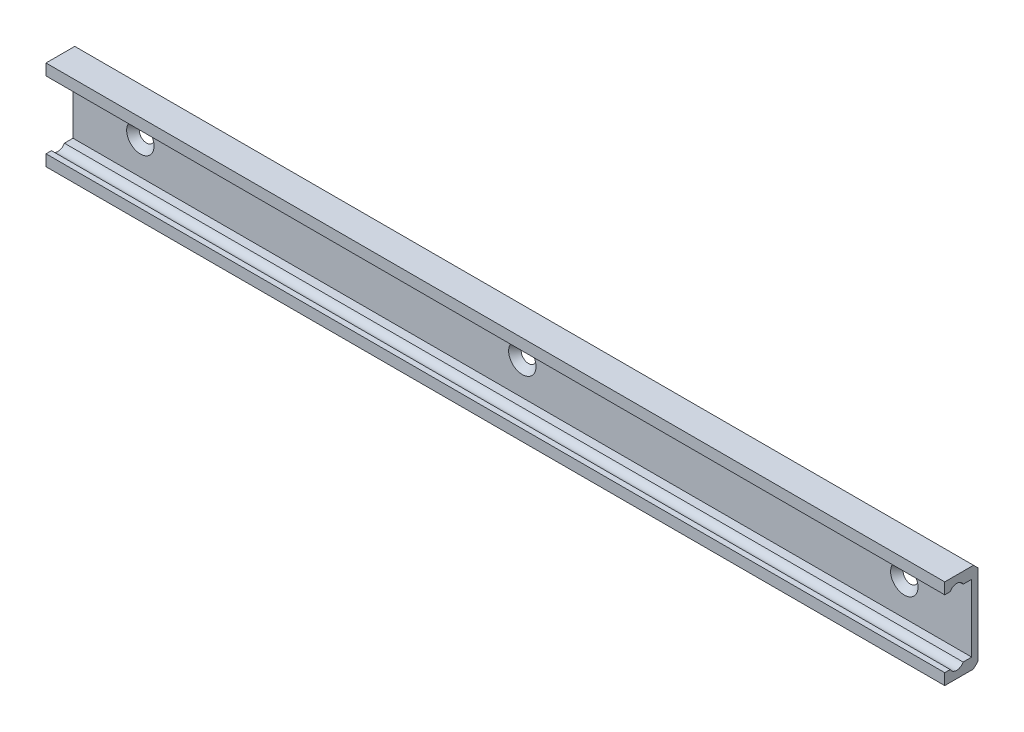
ISO-10303-21;
HEADER;
FILE_DESCRIPTION(('STEP AP214'),'2;1');
FILE_NAME('part.step','',(''),(''),'','','');
FILE_SCHEMA(('AUTOMOTIVE_DESIGN { 1 0 10303 214 1 1 1 1 }'));
ENDSEC;
DATA;
#1=APPLICATION_CONTEXT('core data for automotive mechanical design processes');
#2=APPLICATION_PROTOCOL_DEFINITION('international standard','automotive_design',2000,#1);
#3=PRODUCT_CONTEXT('',#1,'mechanical');
#4=PRODUCT('Part','Part','',(#3));
#5=PRODUCT_RELATED_PRODUCT_CATEGORY('part','',(#4));
#6=PRODUCT_DEFINITION_FORMATION('','',#4);
#7=PRODUCT_DEFINITION_CONTEXT('part definition',#1,'design');
#8=PRODUCT_DEFINITION('design','',#6,#7);
#9=PRODUCT_DEFINITION_SHAPE('','',#8);
#10=(LENGTH_UNIT() NAMED_UNIT(*) SI_UNIT(.MILLI.,.METRE.));
#11=(NAMED_UNIT(*) PLANE_ANGLE_UNIT() SI_UNIT($,.RADIAN.));
#12=(NAMED_UNIT(*) SI_UNIT($,.STERADIAN.) SOLID_ANGLE_UNIT());
#13=UNCERTAINTY_MEASURE_WITH_UNIT(LENGTH_MEASURE(1.E-05),#10,'distance_accuracy_value','');
#14=(GEOMETRIC_REPRESENTATION_CONTEXT(3) GLOBAL_UNCERTAINTY_ASSIGNED_CONTEXT((#13)) GLOBAL_UNIT_ASSIGNED_CONTEXT((#10,
#11,#12)) REPRESENTATION_CONTEXT('',''));
#15=CARTESIAN_POINT('',(0.,0.,0.));
#16=DIRECTION('',(0.,0.,1.));
#17=DIRECTION('',(1.,0.,0.));
#18=AXIS2_PLACEMENT_3D('',#15,#16,#17);
#19=CARTESIAN_POINT('',(185.,10.,7.4));
#20=DIRECTION('',(0.,0.,-1.));
#21=DIRECTION('',(-1.,0.,0.));
#22=AXIS2_PLACEMENT_3D('',#19,#20,#21);
#23=PLANE('',#22);
#24=DIRECTION('',(0.,-1.,0.));
#25=VECTOR('',#24,1.);
#26=CARTESIAN_POINT('',(-15.,10.,7.4));
#27=LINE('',#26,#25);
#28=CARTESIAN_POINT('',(-15.,10.,7.4));
#29=VERTEX_POINT('',#28);
#30=CARTESIAN_POINT('',(-15.,7.5,7.4));
#31=VERTEX_POINT('',#30);
#32=EDGE_CURVE('E162',#29,#31,#27,.T.);
#33=ORIENTED_EDGE('',*,*,#32,.T.);
#34=DIRECTION('',(-1.,0.,0.));
#35=VECTOR('',#34,1.);
#36=CARTESIAN_POINT('',(185.,7.5,7.4));
#37=LINE('',#36,#35);
#38=CARTESIAN_POINT('',(185.,7.5,7.4));
#39=VERTEX_POINT('',#38);
#40=EDGE_CURVE('E145',#39,#31,#37,.T.);
#41=ORIENTED_EDGE('',*,*,#40,.F.);
#42=DIRECTION('',(0.,-1.,0.));
#43=VECTOR('',#42,1.);
#44=CARTESIAN_POINT('',(185.,10.,7.4));
#45=LINE('',#44,#43);
#46=CARTESIAN_POINT('',(185.,10.,7.4));
#47=VERTEX_POINT('',#46);
#48=EDGE_CURVE('E151',#47,#39,#45,.T.);
#49=ORIENTED_EDGE('',*,*,#48,.F.);
#50=DIRECTION('',(-1.,0.,0.));
#51=VECTOR('',#50,1.);
#52=CARTESIAN_POINT('',(185.,10.,7.4));
#53=LINE('',#52,#51);
#54=EDGE_CURVE('E209',#47,#29,#53,.T.);
#55=ORIENTED_EDGE('',*,*,#54,.T.);
#56=EDGE_LOOP('',(#33,#41,#49,#55));
#57=FACE_BOUND('',#56,.T.);
#58=ADVANCED_FACE('F37',(#57),#23,.F.);
#59=CARTESIAN_POINT('',(185.,7.5,7.4));
#60=DIRECTION('',(0.,1.,0.));
#61=DIRECTION('',(0.,0.,1.));
#62=AXIS2_PLACEMENT_3D('',#59,#60,#61);
#63=PLANE('',#62);
#64=DIRECTION('',(0.,0.,-1.));
#65=VECTOR('',#64,1.);
#66=CARTESIAN_POINT('',(-15.,7.5,7.4));
#67=LINE('',#66,#65);
#68=CARTESIAN_POINT('',(-15.,7.5,6.19157032433385));
#69=VERTEX_POINT('',#68);
#70=EDGE_CURVE('E244',#31,#69,#67,.T.);
#71=ORIENTED_EDGE('',*,*,#70,.T.);
#72=DIRECTION('',(-1.,0.,0.));
#73=VECTOR('',#72,1.);
#74=CARTESIAN_POINT('',(185.,7.5,6.19157032433385));
#75=LINE('',#74,#73);
#76=CARTESIAN_POINT('',(185.,7.5,6.19157032433385));
#77=VERTEX_POINT('',#76);
#78=EDGE_CURVE('E148',#77,#69,#75,.T.);
#79=ORIENTED_EDGE('',*,*,#78,.F.);
#80=DIRECTION('',(0.,0.,-1.));
#81=VECTOR('',#80,1.);
#82=CARTESIAN_POINT('',(185.,7.5,7.4));
#83=LINE('',#82,#81);
#84=EDGE_CURVE('E141',#39,#77,#83,.T.);
#85=ORIENTED_EDGE('',*,*,#84,.F.);
#86=ORIENTED_EDGE('',*,*,#40,.T.);
#87=EDGE_LOOP('',(#71,#79,#85,#86));
#88=FACE_BOUND('',#87,.T.);
#89=ADVANCED_FACE('F143',(#88),#63,.F.);
#90=CARTESIAN_POINT('',(185.,6.75,4.75));
#91=DIRECTION('',(-1.,0.,0.));
#92=DIRECTION('',(0.,0.,1.));
#93=AXIS2_PLACEMENT_3D('',#90,#91,#92);
#94=CYLINDRICAL_SURFACE('',#93,1.625);
#95=CARTESIAN_POINT('',(-15.,6.75,4.75));
#96=DIRECTION('',(-1.,0.,0.));
#97=DIRECTION('',(0.,0.,-1.));
#98=AXIS2_PLACEMENT_3D('',#95,#96,#97);
#99=CIRCLE('',#98,1.625);
#100=CARTESIAN_POINT('',(-15.,7.5,3.30842967566615));
#101=VERTEX_POINT('',#100);
#102=EDGE_CURVE('E238',#69,#101,#99,.T.);
#103=ORIENTED_EDGE('',*,*,#102,.T.);
#104=DIRECTION('',(-1.,0.,0.));
#105=VECTOR('',#104,1.);
#106=CARTESIAN_POINT('',(185.,7.5,3.30842967566615));
#107=LINE('',#106,#105);
#108=CARTESIAN_POINT('',(185.,7.5,3.30842967566615));
#109=VERTEX_POINT('',#108);
#110=EDGE_CURVE('E167',#109,#101,#107,.T.);
#111=ORIENTED_EDGE('',*,*,#110,.F.);
#112=CARTESIAN_POINT('',(185.,6.75,4.75));
#113=DIRECTION('',(-1.,0.,0.));
#114=DIRECTION('',(0.,0.,-1.));
#115=AXIS2_PLACEMENT_3D('',#112,#113,#114);
#116=CIRCLE('',#115,1.625);
#117=EDGE_CURVE('E150',#77,#109,#116,.T.);
#118=ORIENTED_EDGE('',*,*,#117,.F.);
#119=ORIENTED_EDGE('',*,*,#78,.T.);
#120=EDGE_LOOP('',(#103,#111,#118,#119));
#121=FACE_BOUND('',#120,.T.);
#122=ADVANCED_FACE('F270',(#121),#94,.F.);
#123=CARTESIAN_POINT('',(185.,7.5,3.30842967566615));
#124=DIRECTION('',(0.,1.,0.));
#125=DIRECTION('',(0.,0.,1.));
#126=AXIS2_PLACEMENT_3D('',#123,#124,#125);
#127=PLANE('',#126);
#128=DIRECTION('',(0.,0.,-1.));
#129=VECTOR('',#128,1.);
#130=CARTESIAN_POINT('',(-15.,7.5,3.30842967566615));
#131=LINE('',#130,#129);
#132=CARTESIAN_POINT('',(-15.,7.5,1.4));
#133=VERTEX_POINT('',#132);
#134=EDGE_CURVE('E233',#101,#133,#131,.T.);
#135=ORIENTED_EDGE('',*,*,#134,.T.);
#136=DIRECTION('',(-1.,0.,0.));
#137=VECTOR('',#136,1.);
#138=CARTESIAN_POINT('',(185.,7.5,1.4));
#139=LINE('',#138,#137);
#140=CARTESIAN_POINT('',(185.,7.5,1.4));
#141=VERTEX_POINT('',#140);
#142=EDGE_CURVE('E224',#141,#133,#139,.T.);
#143=ORIENTED_EDGE('',*,*,#142,.F.);
#144=DIRECTION('',(0.,0.,-1.));
#145=VECTOR('',#144,1.);
#146=CARTESIAN_POINT('',(185.,7.5,3.30842967566615));
#147=LINE('',#146,#145);
#148=EDGE_CURVE('E234',#109,#141,#147,.T.);
#149=ORIENTED_EDGE('',*,*,#148,.F.);
#150=ORIENTED_EDGE('',*,*,#110,.T.);
#151=EDGE_LOOP('',(#135,#143,#149,#150));
#152=FACE_BOUND('',#151,.T.);
#153=ADVANCED_FACE('F231',(#152),#127,.F.);
#154=CARTESIAN_POINT('',(185.,7.5,1.4));
#155=DIRECTION('',(0.,0.,-1.));
#156=DIRECTION('',(0.,1.,0.));
#157=AXIS2_PLACEMENT_3D('',#154,#155,#156);
#158=PLANE('',#157);
#159=CARTESIAN_POINT('',(170.,0.,1.4));
#160=DIRECTION('',(0.,0.,-1.));
#161=DIRECTION('',(0.,1.,0.));
#162=AXIS2_PLACEMENT_3D('',#159,#160,#161);
#163=CIRCLE('',#162,3.05);
#164=CARTESIAN_POINT('',(170.,3.05,1.4));
#165=VERTEX_POINT('',#164);
#166=EDGE_CURVE('E396',#165,#165,#163,.T.);
#167=ORIENTED_EDGE('',*,*,#166,.T.);
#168=EDGE_LOOP('',(#167));
#169=FACE_BOUND('',#168,.T.);
#170=CARTESIAN_POINT('',(85.,0.,1.4));
#171=DIRECTION('',(0.,0.,-1.));
#172=DIRECTION('',(0.,1.,0.));
#173=AXIS2_PLACEMENT_3D('',#170,#171,#172);
#174=CIRCLE('',#173,3.05);
#175=CARTESIAN_POINT('',(85.,3.05,1.4));
#176=VERTEX_POINT('',#175);
#177=EDGE_CURVE('E400',#176,#176,#174,.T.);
#178=ORIENTED_EDGE('',*,*,#177,.T.);
#179=EDGE_LOOP('',(#178));
#180=FACE_BOUND('',#179,.T.);
#181=CARTESIAN_POINT('',(0.,0.,1.4));
#182=DIRECTION('',(0.,0.,-1.));
#183=DIRECTION('',(0.,1.,0.));
#184=AXIS2_PLACEMENT_3D('',#181,#182,#183);
#185=CIRCLE('',#184,3.05);
#186=CARTESIAN_POINT('',(0.,3.05,1.4));
#187=VERTEX_POINT('',#186);
#188=EDGE_CURVE('E409',#187,#187,#185,.T.);
#189=ORIENTED_EDGE('',*,*,#188,.T.);
#190=EDGE_LOOP('',(#189));
#191=FACE_BOUND('',#190,.T.);
#192=DIRECTION('',(0.,-1.,0.));
#193=VECTOR('',#192,1.);
#194=CARTESIAN_POINT('',(-15.,7.5,1.4));
#195=LINE('',#194,#193);
#196=CARTESIAN_POINT('',(-15.,-7.5,1.4));
#197=VERTEX_POINT('',#196);
#198=EDGE_CURVE('E240',#133,#197,#195,.T.);
#199=ORIENTED_EDGE('',*,*,#198,.T.);
#200=DIRECTION('',(-1.,0.,0.));
#201=VECTOR('',#200,1.);
#202=CARTESIAN_POINT('',(185.,-7.5,1.4));
#203=LINE('',#202,#201);
#204=CARTESIAN_POINT('',(185.,-7.5,1.4));
#205=VERTEX_POINT('',#204);
#206=EDGE_CURVE('E221',#205,#197,#203,.T.);
#207=ORIENTED_EDGE('',*,*,#206,.F.);
#208=DIRECTION('',(0.,-1.,0.));
#209=VECTOR('',#208,1.);
#210=CARTESIAN_POINT('',(185.,7.5,1.4));
#211=LINE('',#210,#209);
#212=EDGE_CURVE('E272',#141,#205,#211,.T.);
#213=ORIENTED_EDGE('',*,*,#212,.F.);
#214=ORIENTED_EDGE('',*,*,#142,.T.);
#215=EDGE_LOOP('',(#199,#207,#213,#214));
#216=FACE_BOUND('',#215,.T.);
#217=ADVANCED_FACE('F287',(#169,#180,#191,#216),#158,.F.);
#218=CARTESIAN_POINT('',(185.,-7.5,3.30842967566615));
#219=DIRECTION('',(0.,-1.,0.));
#220=DIRECTION('',(0.,0.,-1.));
#221=AXIS2_PLACEMENT_3D('',#218,#219,#220);
#222=PLANE('',#221);
#223=DIRECTION('',(0.,0.,1.));
#224=VECTOR('',#223,1.);
#225=CARTESIAN_POINT('',(-15.,-7.5,3.30842967566615));
#226=LINE('',#225,#224);
#227=CARTESIAN_POINT('',(-15.,-7.5,3.30842967566615));
#228=VERTEX_POINT('',#227);
#229=EDGE_CURVE('E242',#197,#228,#226,.T.);
#230=ORIENTED_EDGE('',*,*,#229,.T.);
#231=DIRECTION('',(-1.,0.,0.));
#232=VECTOR('',#231,1.);
#233=CARTESIAN_POINT('',(185.,-7.5,3.30842967566615));
#234=LINE('',#233,#232);
#235=CARTESIAN_POINT('',(185.,-7.5,3.30842967566615));
#236=VERTEX_POINT('',#235);
#237=EDGE_CURVE('E218',#236,#228,#234,.T.);
#238=ORIENTED_EDGE('',*,*,#237,.F.);
#239=DIRECTION('',(0.,0.,1.));
#240=VECTOR('',#239,1.);
#241=CARTESIAN_POINT('',(185.,-7.5,3.30842967566615));
#242=LINE('',#241,#240);
#243=EDGE_CURVE('E276',#205,#236,#242,.T.);
#244=ORIENTED_EDGE('',*,*,#243,.F.);
#245=ORIENTED_EDGE('',*,*,#206,.T.);
#246=EDGE_LOOP('',(#230,#238,#244,#245));
#247=FACE_BOUND('',#246,.T.);
#248=ADVANCED_FACE('F283',(#247),#222,.F.);
#249=CARTESIAN_POINT('',(185.,-6.75,4.75));
#250=DIRECTION('',(-1.,0.,0.));
#251=DIRECTION('',(0.,0.,1.));
#252=AXIS2_PLACEMENT_3D('',#249,#250,#251);
#253=CYLINDRICAL_SURFACE('',#252,1.625);
#254=CARTESIAN_POINT('',(-15.,-6.75,4.75));
#255=DIRECTION('',(-1.,0.,0.));
#256=DIRECTION('',(0.,0.,-1.));
#257=AXIS2_PLACEMENT_3D('',#254,#255,#256);
#258=CIRCLE('',#257,1.625);
#259=CARTESIAN_POINT('',(-15.,-7.5,6.19157032433385));
#260=VERTEX_POINT('',#259);
#261=EDGE_CURVE('E249',#228,#260,#258,.T.);
#262=ORIENTED_EDGE('',*,*,#261,.T.);
#263=DIRECTION('',(-1.,0.,0.));
#264=VECTOR('',#263,1.);
#265=CARTESIAN_POINT('',(185.,-7.5,6.19157032433385));
#266=LINE('',#265,#264);
#267=CARTESIAN_POINT('',(185.,-7.5,6.19157032433385));
#268=VERTEX_POINT('',#267);
#269=EDGE_CURVE('E215',#268,#260,#266,.T.);
#270=ORIENTED_EDGE('',*,*,#269,.F.);
#271=CARTESIAN_POINT('',(185.,-6.75,4.75));
#272=DIRECTION('',(-1.,0.,0.));
#273=DIRECTION('',(0.,0.,-1.));
#274=AXIS2_PLACEMENT_3D('',#271,#272,#273);
#275=CIRCLE('',#274,1.625);
#276=EDGE_CURVE('E264',#236,#268,#275,.T.);
#277=ORIENTED_EDGE('',*,*,#276,.F.);
#278=ORIENTED_EDGE('',*,*,#237,.T.);
#279=EDGE_LOOP('',(#262,#270,#277,#278));
#280=FACE_BOUND('',#279,.T.);
#281=ADVANCED_FACE('F281',(#280),#253,.F.);
#282=CARTESIAN_POINT('',(185.,-7.5,7.4));
#283=DIRECTION('',(0.,-1.,0.));
#284=DIRECTION('',(0.,0.,-1.));
#285=AXIS2_PLACEMENT_3D('',#282,#283,#284);
#286=PLANE('',#285);
#287=DIRECTION('',(0.,0.,1.));
#288=VECTOR('',#287,1.);
#289=CARTESIAN_POINT('',(-15.,-7.5,7.4));
#290=LINE('',#289,#288);
#291=CARTESIAN_POINT('',(-15.,-7.5,7.4));
#292=VERTEX_POINT('',#291);
#293=EDGE_CURVE('E204',#260,#292,#290,.T.);
#294=ORIENTED_EDGE('',*,*,#293,.T.);
#295=DIRECTION('',(-1.,0.,0.));
#296=VECTOR('',#295,1.);
#297=CARTESIAN_POINT('',(185.,-7.5,7.4));
#298=LINE('',#297,#296);
#299=CARTESIAN_POINT('',(185.,-7.5,7.4));
#300=VERTEX_POINT('',#299);
#301=EDGE_CURVE('E212',#300,#292,#298,.T.);
#302=ORIENTED_EDGE('',*,*,#301,.F.);
#303=DIRECTION('',(0.,0.,1.));
#304=VECTOR('',#303,1.);
#305=CARTESIAN_POINT('',(185.,-7.5,7.4));
#306=LINE('',#305,#304);
#307=EDGE_CURVE('E261',#268,#300,#306,.T.);
#308=ORIENTED_EDGE('',*,*,#307,.F.);
#309=ORIENTED_EDGE('',*,*,#269,.T.);
#310=EDGE_LOOP('',(#294,#302,#308,#309));
#311=FACE_BOUND('',#310,.T.);
#312=ADVANCED_FACE('F253',(#311),#286,.F.);
#313=CARTESIAN_POINT('',(185.,-7.5,7.4));
#314=DIRECTION('',(0.,0.,-1.));
#315=DIRECTION('',(0.,1.,0.));
#316=AXIS2_PLACEMENT_3D('',#313,#314,#315);
#317=PLANE('',#316);
#318=DIRECTION('',(0.,-1.,0.));
#319=VECTOR('',#318,1.);
#320=CARTESIAN_POINT('',(-15.,-7.5,7.4));
#321=LINE('',#320,#319);
#322=CARTESIAN_POINT('',(-15.,-10.,7.4));
#323=VERTEX_POINT('',#322);
#324=EDGE_CURVE('E201',#292,#323,#321,.T.);
#325=ORIENTED_EDGE('',*,*,#324,.T.);
#326=DIRECTION('',(-1.,0.,0.));
#327=VECTOR('',#326,1.);
#328=CARTESIAN_POINT('',(185.,-10.,7.4));
#329=LINE('',#328,#327);
#330=CARTESIAN_POINT('',(185.,-10.,7.4));
#331=VERTEX_POINT('',#330);
#332=EDGE_CURVE('E200',#331,#323,#329,.T.);
#333=ORIENTED_EDGE('',*,*,#332,.F.);
#334=DIRECTION('',(0.,-1.,0.));
#335=VECTOR('',#334,1.);
#336=CARTESIAN_POINT('',(185.,-7.5,7.4));
#337=LINE('',#336,#335);
#338=EDGE_CURVE('E260',#300,#331,#337,.T.);
#339=ORIENTED_EDGE('',*,*,#338,.F.);
#340=ORIENTED_EDGE('',*,*,#301,.T.);
#341=EDGE_LOOP('',(#325,#333,#339,#340));
#342=FACE_BOUND('',#341,.T.);
#343=ADVANCED_FACE('F259',(#342),#317,.F.);
#344=CARTESIAN_POINT('',(185.,-10.,7.4));
#345=DIRECTION('',(0.,1.,0.));
#346=DIRECTION('',(0.,0.,1.));
#347=AXIS2_PLACEMENT_3D('',#344,#345,#346);
#348=PLANE('',#347);
#349=DIRECTION('',(0.,0.,-1.));
#350=VECTOR('',#349,1.);
#351=CARTESIAN_POINT('',(-15.,-10.,7.4));
#352=LINE('',#351,#350);
#353=CARTESIAN_POINT('',(-15.,-10.,1.00000000000003));
#354=VERTEX_POINT('',#353);
#355=EDGE_CURVE('E195',#323,#354,#352,.T.);
#356=ORIENTED_EDGE('',*,*,#355,.T.);
#357=DIRECTION('',(1.,0.,0.));
#358=VECTOR('',#357,1.);
#359=CARTESIAN_POINT('',(185.,-10.,1.00000000000003));
#360=LINE('',#359,#358);
#361=CARTESIAN_POINT('',(185.,-10.,1.00000000000003));
#362=VERTEX_POINT('',#361);
#363=EDGE_CURVE('E60',#354,#362,#360,.T.);
#364=ORIENTED_EDGE('',*,*,#363,.T.);
#365=DIRECTION('',(0.,0.,-1.));
#366=VECTOR('',#365,1.);
#367=CARTESIAN_POINT('',(185.,-10.,7.4));
#368=LINE('',#367,#366);
#369=EDGE_CURVE('E181',#331,#362,#368,.T.);
#370=ORIENTED_EDGE('',*,*,#369,.F.);
#371=ORIENTED_EDGE('',*,*,#332,.T.);
#372=EDGE_LOOP('',(#356,#364,#370,#371));
#373=FACE_BOUND('',#372,.T.);
#374=ADVANCED_FACE('F198',(#373),#348,.F.);
#375=CARTESIAN_POINT('',(185.,10.,0.));
#376=DIRECTION('',(0.,0.,1.));
#377=DIRECTION('',(0.,-1.,0.));
#378=AXIS2_PLACEMENT_3D('',#375,#376,#377);
#379=PLANE('',#378);
#380=CARTESIAN_POINT('',(170.,0.,0.));
#381=DIRECTION('',(0.,0.,-1.));
#382=DIRECTION('',(0.,1.,0.));
#383=AXIS2_PLACEMENT_3D('',#380,#381,#382);
#384=CIRCLE('',#383,1.65000000000001);
#385=CARTESIAN_POINT('',(170.,1.65000000000001,0.));
#386=VERTEX_POINT('',#385);
#387=EDGE_CURVE('E399',#386,#386,#384,.T.);
#388=ORIENTED_EDGE('',*,*,#387,.F.);
#389=EDGE_LOOP('',(#388));
#390=FACE_BOUND('',#389,.T.);
#391=CARTESIAN_POINT('',(85.,0.,0.));
#392=DIRECTION('',(0.,0.,-1.));
#393=DIRECTION('',(0.,1.,0.));
#394=AXIS2_PLACEMENT_3D('',#391,#392,#393);
#395=CIRCLE('',#394,1.65000000000001);
#396=CARTESIAN_POINT('',(85.,1.65000000000001,0.));
#397=VERTEX_POINT('',#396);
#398=EDGE_CURVE('E403',#397,#397,#395,.T.);
#399=ORIENTED_EDGE('',*,*,#398,.F.);
#400=EDGE_LOOP('',(#399));
#401=FACE_BOUND('',#400,.T.);
#402=CARTESIAN_POINT('',(0.,0.,0.));
#403=DIRECTION('',(0.,0.,-1.));
#404=DIRECTION('',(0.,1.,0.));
#405=AXIS2_PLACEMENT_3D('',#402,#403,#404);
#406=CIRCLE('',#405,1.65000000000001);
#407=CARTESIAN_POINT('',(0.,1.65000000000001,0.));
#408=VERTEX_POINT('',#407);
#409=EDGE_CURVE('E269',#408,#408,#406,.T.);
#410=ORIENTED_EDGE('',*,*,#409,.F.);
#411=EDGE_LOOP('',(#410));
#412=FACE_BOUND('',#411,.T.);
#413=DIRECTION('',(0.,1.,0.));
#414=VECTOR('',#413,1.);
#415=CARTESIAN_POINT('',(185.,10.,0.));
#416=LINE('',#415,#414);
#417=CARTESIAN_POINT('',(185.,-9.,0.));
#418=VERTEX_POINT('',#417);
#419=CARTESIAN_POINT('',(185.,8.99999999999997,0.));
#420=VERTEX_POINT('',#419);
#421=EDGE_CURVE('E180',#418,#420,#416,.T.);
#422=ORIENTED_EDGE('',*,*,#421,.F.);
#423=DIRECTION('',(-1.,0.,0.));
#424=VECTOR('',#423,1.);
#425=CARTESIAN_POINT('',(185.,-9.,0.));
#426=LINE('',#425,#424);
#427=CARTESIAN_POINT('',(-15.,-9.,0.));
#428=VERTEX_POINT('',#427);
#429=EDGE_CURVE('E165',#418,#428,#426,.T.);
#430=ORIENTED_EDGE('',*,*,#429,.T.);
#431=DIRECTION('',(0.,1.,0.));
#432=VECTOR('',#431,1.);
#433=CARTESIAN_POINT('',(-15.,10.,0.));
#434=LINE('',#433,#432);
#435=CARTESIAN_POINT('',(-15.,8.99999999999997,0.));
#436=VERTEX_POINT('',#435);
#437=EDGE_CURVE('E196',#428,#436,#434,.T.);
#438=ORIENTED_EDGE('',*,*,#437,.T.);
#439=DIRECTION('',(1.,0.,0.));
#440=VECTOR('',#439,1.);
#441=CARTESIAN_POINT('',(185.,8.99999999999997,0.));
#442=LINE('',#441,#440);
#443=EDGE_CURVE('E163',#436,#420,#442,.T.);
#444=ORIENTED_EDGE('',*,*,#443,.T.);
#445=EDGE_LOOP('',(#422,#430,#438,#444));
#446=FACE_BOUND('',#445,.T.);
#447=ADVANCED_FACE('F185',(#390,#401,#412,#446),#379,.F.);
#448=CARTESIAN_POINT('',(185.,10.,7.4));
#449=DIRECTION('',(0.,-1.,0.));
#450=DIRECTION('',(0.,0.,-1.));
#451=AXIS2_PLACEMENT_3D('',#448,#449,#450);
#452=PLANE('',#451);
#453=DIRECTION('',(0.,0.,1.));
#454=VECTOR('',#453,1.);
#455=CARTESIAN_POINT('',(185.,10.,7.4));
#456=LINE('',#455,#454);
#457=CARTESIAN_POINT('',(185.,10.,1.00000000000006));
#458=VERTEX_POINT('',#457);
#459=EDGE_CURVE('E155',#458,#47,#456,.T.);
#460=ORIENTED_EDGE('',*,*,#459,.F.);
#461=DIRECTION('',(-1.,0.,0.));
#462=VECTOR('',#461,1.);
#463=CARTESIAN_POINT('',(185.,10.,1.00000000000006));
#464=LINE('',#463,#462);
#465=CARTESIAN_POINT('',(-15.,10.,1.00000000000006));
#466=VERTEX_POINT('',#465);
#467=EDGE_CURVE('E11',#458,#466,#464,.T.);
#468=ORIENTED_EDGE('',*,*,#467,.T.);
#469=DIRECTION('',(0.,0.,1.));
#470=VECTOR('',#469,1.);
#471=CARTESIAN_POINT('',(-15.,10.,7.4));
#472=LINE('',#471,#470);
#473=EDGE_CURVE('E159',#466,#29,#472,.T.);
#474=ORIENTED_EDGE('',*,*,#473,.T.);
#475=ORIENTED_EDGE('',*,*,#54,.F.);
#476=EDGE_LOOP('',(#460,#468,#474,#475));
#477=FACE_BOUND('',#476,.T.);
#478=ADVANCED_FACE('F319',(#477),#452,.F.);
#479=CARTESIAN_POINT('',(185.,6.75,4.75));
#480=DIRECTION('',(1.,0.,0.));
#481=DIRECTION('',(0.,0.,-1.));
#482=AXIS2_PLACEMENT_3D('',#479,#480,#481);
#483=PLANE('',#482);
#484=ORIENTED_EDGE('',*,*,#369,.T.);
#485=DIRECTION('',(0.,-0.707106781186538,0.707106781186557));
#486=VECTOR('',#485,1.);
#487=CARTESIAN_POINT('',(185.,-3.50000000000022,-5.49999999999994));
#488=LINE('',#487,#486);
#489=EDGE_CURVE('E45',#362,#418,#488,.F.);
#490=ORIENTED_EDGE('',*,*,#489,.T.);
#491=ORIENTED_EDGE('',*,*,#421,.T.);
#492=DIRECTION('',(0.,-0.707106781186538,-0.707106781186557));
#493=VECTOR('',#492,1.);
#494=CARTESIAN_POINT('',(185.,10.25,1.25000000000008));
#495=LINE('',#494,#493);
#496=EDGE_CURVE('E52',#420,#458,#495,.F.);
#497=ORIENTED_EDGE('',*,*,#496,.T.);
#498=ORIENTED_EDGE('',*,*,#459,.T.);
#499=ORIENTED_EDGE('',*,*,#48,.T.);
#500=ORIENTED_EDGE('',*,*,#84,.T.);
#501=ORIENTED_EDGE('',*,*,#117,.T.);
#502=ORIENTED_EDGE('',*,*,#148,.T.);
#503=ORIENTED_EDGE('',*,*,#212,.T.);
#504=ORIENTED_EDGE('',*,*,#243,.T.);
#505=ORIENTED_EDGE('',*,*,#276,.T.);
#506=ORIENTED_EDGE('',*,*,#307,.T.);
#507=ORIENTED_EDGE('',*,*,#338,.T.);
#508=EDGE_LOOP('',(#484,#490,#491,#497,#498,#499,#500,#501,#502,#503,#504,#505,#506,#507));
#509=FACE_BOUND('',#508,.T.);
#510=ADVANCED_FACE('F154',(#509),#483,.T.);
#511=CARTESIAN_POINT('',(-15.,6.75,4.75));
#512=DIRECTION('',(1.,0.,0.));
#513=DIRECTION('',(0.,0.,-1.));
#514=AXIS2_PLACEMENT_3D('',#511,#512,#513);
#515=PLANE('',#514);
#516=ORIENTED_EDGE('',*,*,#437,.F.);
#517=DIRECTION('',(0.,0.707106781186538,-0.707106781186557));
#518=VECTOR('',#517,1.);
#519=CARTESIAN_POINT('',(-15.,-9.,0.));
#520=LINE('',#519,#518);
#521=EDGE_CURVE('E175',#428,#354,#520,.F.);
#522=ORIENTED_EDGE('',*,*,#521,.T.);
#523=ORIENTED_EDGE('',*,*,#355,.F.);
#524=ORIENTED_EDGE('',*,*,#324,.F.);
#525=ORIENTED_EDGE('',*,*,#293,.F.);
#526=ORIENTED_EDGE('',*,*,#261,.F.);
#527=ORIENTED_EDGE('',*,*,#229,.F.);
#528=ORIENTED_EDGE('',*,*,#198,.F.);
#529=ORIENTED_EDGE('',*,*,#134,.F.);
#530=ORIENTED_EDGE('',*,*,#102,.F.);
#531=ORIENTED_EDGE('',*,*,#70,.F.);
#532=ORIENTED_EDGE('',*,*,#32,.F.);
#533=ORIENTED_EDGE('',*,*,#473,.F.);
#534=DIRECTION('',(0.,0.707106781186538,0.707106781186557));
#535=VECTOR('',#534,1.);
#536=CARTESIAN_POINT('',(-15.,10.,1.00000000000006));
#537=LINE('',#536,#535);
#538=EDGE_CURVE('E173',#466,#436,#537,.F.);
#539=ORIENTED_EDGE('',*,*,#538,.T.);
#540=EDGE_LOOP('',(#516,#522,#523,#524,#525,#526,#527,#528,#529,#530,#531,#532,#533,#539));
#541=FACE_BOUND('',#540,.T.);
#542=ADVANCED_FACE('F193',(#541),#515,.F.);
#543=CARTESIAN_POINT('',(185.,-9.,0.));
#544=DIRECTION('',(0.,0.707106781186557,0.707106781186538));
#545=DIRECTION('',(-1.,0.,0.));
#546=AXIS2_PLACEMENT_3D('',#543,#544,#545);
#547=PLANE('',#546);
#548=ORIENTED_EDGE('',*,*,#489,.F.);
#549=ORIENTED_EDGE('',*,*,#363,.F.);
#550=ORIENTED_EDGE('',*,*,#521,.F.);
#551=ORIENTED_EDGE('',*,*,#429,.F.);
#552=EDGE_LOOP('',(#548,#549,#550,#551));
#553=FACE_BOUND('',#552,.T.);
#554=ADVANCED_FACE('F190',(#553),#547,.F.);
#555=CARTESIAN_POINT('',(185.,10.,1.00000000000006));
#556=DIRECTION('',(0.,-0.707106781186557,0.707106781186538));
#557=DIRECTION('',(-1.,0.,0.));
#558=AXIS2_PLACEMENT_3D('',#555,#556,#557);
#559=PLANE('',#558);
#560=ORIENTED_EDGE('',*,*,#496,.F.);
#561=ORIENTED_EDGE('',*,*,#443,.F.);
#562=ORIENTED_EDGE('',*,*,#538,.F.);
#563=ORIENTED_EDGE('',*,*,#467,.F.);
#564=EDGE_LOOP('',(#560,#561,#562,#563));
#565=FACE_BOUND('',#564,.T.);
#566=ADVANCED_FACE('F39',(#565),#559,.F.);
#567=CARTESIAN_POINT('',(0.,0.,0.));
#568=DIRECTION('',(0.,0.,1.));
#569=DIRECTION('',(0.,-1.,0.));
#570=AXIS2_PLACEMENT_3D('',#567,#568,#569);
#571=CONICAL_SURFACE('',#570,1.65000000000001,0.785398163397443);
#572=ORIENTED_EDGE('',*,*,#188,.F.);
#573=EDGE_LOOP('',(#572));
#574=FACE_BOUND('',#573,.T.);
#575=ORIENTED_EDGE('',*,*,#409,.T.);
#576=EDGE_LOOP('',(#575));
#577=FACE_BOUND('',#576,.T.);
#578=ADVANCED_FACE('F313',(#574,#577),#571,.F.);
#579=CARTESIAN_POINT('',(85.,0.,0.));
#580=DIRECTION('',(0.,0.,1.));
#581=DIRECTION('',(0.,-1.,0.));
#582=AXIS2_PLACEMENT_3D('',#579,#580,#581);
#583=CONICAL_SURFACE('',#582,1.65000000000001,0.785398163397443);
#584=ORIENTED_EDGE('',*,*,#177,.F.);
#585=EDGE_LOOP('',(#584));
#586=FACE_BOUND('',#585,.T.);
#587=ORIENTED_EDGE('',*,*,#398,.T.);
#588=EDGE_LOOP('',(#587));
#589=FACE_BOUND('',#588,.T.);
#590=ADVANCED_FACE('F375',(#586,#589),#583,.F.);
#591=CARTESIAN_POINT('',(170.,0.,0.));
#592=DIRECTION('',(0.,0.,1.));
#593=DIRECTION('',(0.,-1.,0.));
#594=AXIS2_PLACEMENT_3D('',#591,#592,#593);
#595=CONICAL_SURFACE('',#594,1.65000000000001,0.785398163397443);
#596=ORIENTED_EDGE('',*,*,#166,.F.);
#597=EDGE_LOOP('',(#596));
#598=FACE_BOUND('',#597,.T.);
#599=ORIENTED_EDGE('',*,*,#387,.T.);
#600=EDGE_LOOP('',(#599));
#601=FACE_BOUND('',#600,.T.);
#602=ADVANCED_FACE('F381',(#598,#601),#595,.F.);
#603=CLOSED_SHELL('',(#58,#89,#122,#153,#217,#248,#281,#312,#343,#374,#447,#478,#510,#542,#554,
#566,#578,#590,#602));
#604=MANIFOLD_SOLID_BREP('B2',#603);
#605=ADVANCED_BREP_SHAPE_REPRESENTATION('',(#18,#604),#14);
#606=SHAPE_DEFINITION_REPRESENTATION(#9,#605);
ENDSEC;
END-ISO-10303-21;
